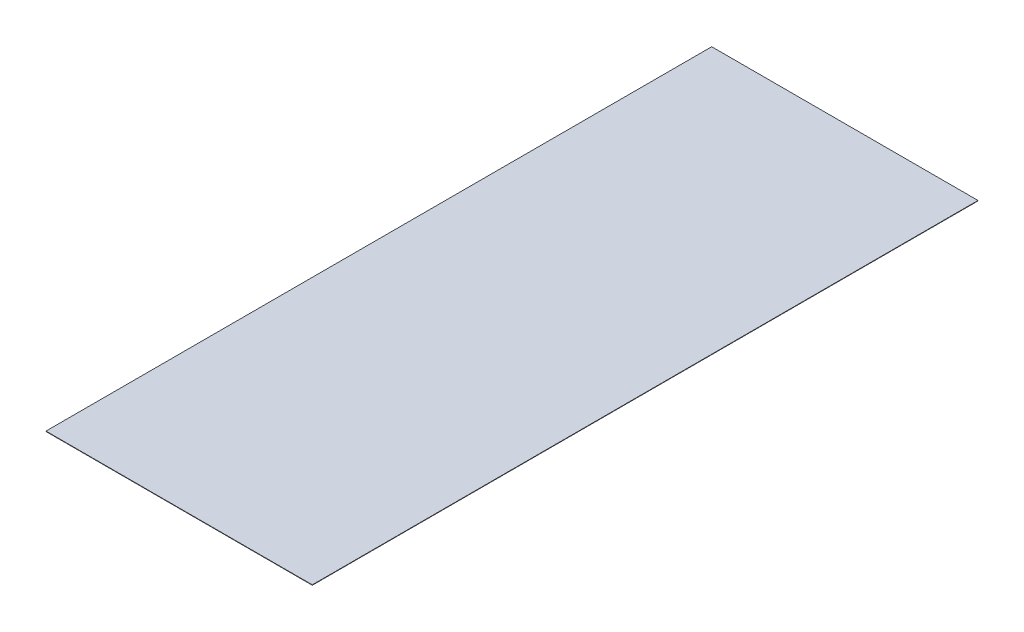
ISO-10303-21;
HEADER;
FILE_DESCRIPTION(('STEP AP214'),'2;1');
FILE_NAME('part.step','',(''),(''),'','','');
FILE_SCHEMA(('AUTOMOTIVE_DESIGN { 1 0 10303 214 1 1 1 1 }'));
ENDSEC;
DATA;
#1=APPLICATION_CONTEXT('core data for automotive mechanical design processes');
#2=APPLICATION_PROTOCOL_DEFINITION('international standard','automotive_design',2000,#1);
#3=PRODUCT_CONTEXT('',#1,'mechanical');
#4=PRODUCT('Part','Part','',(#3));
#5=PRODUCT_RELATED_PRODUCT_CATEGORY('part','',(#4));
#6=PRODUCT_DEFINITION_FORMATION('','',#4);
#7=PRODUCT_DEFINITION_CONTEXT('part definition',#1,'design');
#8=PRODUCT_DEFINITION('design','',#6,#7);
#9=PRODUCT_DEFINITION_SHAPE('','',#8);
#10=(LENGTH_UNIT() NAMED_UNIT(*) SI_UNIT(.MILLI.,.METRE.));
#11=(NAMED_UNIT(*) PLANE_ANGLE_UNIT() SI_UNIT($,.RADIAN.));
#12=(NAMED_UNIT(*) SI_UNIT($,.STERADIAN.) SOLID_ANGLE_UNIT());
#13=UNCERTAINTY_MEASURE_WITH_UNIT(LENGTH_MEASURE(1.E-05),#10,'distance_accuracy_value','');
#14=(GEOMETRIC_REPRESENTATION_CONTEXT(3) GLOBAL_UNCERTAINTY_ASSIGNED_CONTEXT((#13)) GLOBAL_UNIT_ASSIGNED_CONTEXT((#10,
#11,#12)) REPRESENTATION_CONTEXT('',''));
#15=CARTESIAN_POINT('',(0.,0.,0.));
#16=DIRECTION('',(0.,0.,1.));
#17=DIRECTION('',(1.,0.,0.));
#18=AXIS2_PLACEMENT_3D('',#15,#16,#17);
#19=CARTESIAN_POINT('',(609.6,1.9,1524.));
#20=DIRECTION('',(-1.,0.,0.));
#21=DIRECTION('',(0.,0.,1.));
#22=AXIS2_PLACEMENT_3D('',#19,#20,#21);
#23=PLANE('',#22);
#24=DIRECTION('',(0.,0.,-1.));
#25=VECTOR('',#24,1.);
#26=CARTESIAN_POINT('',(609.6,0.,1524.));
#27=LINE('',#26,#25);
#28=CARTESIAN_POINT('',(609.6,0.,1524.));
#29=VERTEX_POINT('',#28);
#30=CARTESIAN_POINT('',(609.6,0.,-1524.));
#31=VERTEX_POINT('',#30);
#32=EDGE_CURVE('E96',#29,#31,#27,.T.);
#33=ORIENTED_EDGE('',*,*,#32,.T.);
#34=DIRECTION('',(0.,-1.,0.));
#35=VECTOR('',#34,1.);
#36=CARTESIAN_POINT('',(609.6,1.9,-1524.));
#37=LINE('',#36,#35);
#38=CARTESIAN_POINT('',(609.6,1.9,-1524.));
#39=VERTEX_POINT('',#38);
#40=EDGE_CURVE('E11',#39,#31,#37,.T.);
#41=ORIENTED_EDGE('',*,*,#40,.F.);
#42=DIRECTION('',(0.,0.,-1.));
#43=VECTOR('',#42,1.);
#44=CARTESIAN_POINT('',(609.6,1.9,1524.));
#45=LINE('',#44,#43);
#46=CARTESIAN_POINT('',(609.6,1.9,1524.));
#47=VERTEX_POINT('',#46);
#48=EDGE_CURVE('E84',#47,#39,#45,.T.);
#49=ORIENTED_EDGE('',*,*,#48,.F.);
#50=DIRECTION('',(0.,-1.,0.));
#51=VECTOR('',#50,1.);
#52=CARTESIAN_POINT('',(609.6,1.9,1524.));
#53=LINE('',#52,#51);
#54=EDGE_CURVE('E92',#47,#29,#53,.T.);
#55=ORIENTED_EDGE('',*,*,#54,.T.);
#56=EDGE_LOOP('',(#33,#41,#49,#55));
#57=FACE_BOUND('',#56,.T.);
#58=ADVANCED_FACE('F33',(#57),#23,.F.);
#59=CARTESIAN_POINT('',(-609.6,1.9,-1524.));
#60=DIRECTION('',(0.,0.,1.));
#61=DIRECTION('',(1.,0.,0.));
#62=AXIS2_PLACEMENT_3D('',#59,#60,#61);
#63=PLANE('',#62);
#64=DIRECTION('',(-1.,0.,0.));
#65=VECTOR('',#64,1.);
#66=CARTESIAN_POINT('',(-609.6,0.,-1524.));
#67=LINE('',#66,#65);
#68=CARTESIAN_POINT('',(-609.6,0.,-1524.));
#69=VERTEX_POINT('',#68);
#70=EDGE_CURVE('E88',#31,#69,#67,.T.);
#71=ORIENTED_EDGE('',*,*,#70,.T.);
#72=DIRECTION('',(0.,-1.,0.));
#73=VECTOR('',#72,1.);
#74=CARTESIAN_POINT('',(-609.6,1.9,-1524.));
#75=LINE('',#74,#73);
#76=CARTESIAN_POINT('',(-609.6,1.9,-1524.));
#77=VERTEX_POINT('',#76);
#78=EDGE_CURVE('E41',#77,#69,#75,.T.);
#79=ORIENTED_EDGE('',*,*,#78,.F.);
#80=DIRECTION('',(-1.,0.,0.));
#81=VECTOR('',#80,1.);
#82=CARTESIAN_POINT('',(-609.6,1.9,-1524.));
#83=LINE('',#82,#81);
#84=EDGE_CURVE('E79',#39,#77,#83,.T.);
#85=ORIENTED_EDGE('',*,*,#84,.F.);
#86=ORIENTED_EDGE('',*,*,#40,.T.);
#87=EDGE_LOOP('',(#71,#79,#85,#86));
#88=FACE_BOUND('',#87,.T.);
#89=ADVANCED_FACE('F87',(#88),#63,.F.);
#90=CARTESIAN_POINT('',(-609.6,1.9,1524.));
#91=DIRECTION('',(1.,0.,0.));
#92=DIRECTION('',(0.,0.,-1.));
#93=AXIS2_PLACEMENT_3D('',#90,#91,#92);
#94=PLANE('',#93);
#95=DIRECTION('',(0.,0.,1.));
#96=VECTOR('',#95,1.);
#97=CARTESIAN_POINT('',(-609.6,0.,1524.));
#98=LINE('',#97,#96);
#99=CARTESIAN_POINT('',(-609.6,0.,1524.));
#100=VERTEX_POINT('',#99);
#101=EDGE_CURVE('E66',#69,#100,#98,.T.);
#102=ORIENTED_EDGE('',*,*,#101,.T.);
#103=DIRECTION('',(0.,-1.,0.));
#104=VECTOR('',#103,1.);
#105=CARTESIAN_POINT('',(-609.6,1.9,1524.));
#106=LINE('',#105,#104);
#107=CARTESIAN_POINT('',(-609.6,1.9,1524.));
#108=VERTEX_POINT('',#107);
#109=EDGE_CURVE('E89',#108,#100,#106,.T.);
#110=ORIENTED_EDGE('',*,*,#109,.F.);
#111=DIRECTION('',(0.,0.,1.));
#112=VECTOR('',#111,1.);
#113=CARTESIAN_POINT('',(-609.6,1.9,1524.));
#114=LINE('',#113,#112);
#115=EDGE_CURVE('E82',#77,#108,#114,.T.);
#116=ORIENTED_EDGE('',*,*,#115,.F.);
#117=ORIENTED_EDGE('',*,*,#78,.T.);
#118=EDGE_LOOP('',(#102,#110,#116,#117));
#119=FACE_BOUND('',#118,.T.);
#120=ADVANCED_FACE('F90',(#119),#94,.F.);
#121=CARTESIAN_POINT('',(-609.6,1.9,1524.));
#122=DIRECTION('',(0.,0.,-1.));
#123=DIRECTION('',(-1.,0.,0.));
#124=AXIS2_PLACEMENT_3D('',#121,#122,#123);
#125=PLANE('',#124);
#126=DIRECTION('',(1.,0.,0.));
#127=VECTOR('',#126,1.);
#128=CARTESIAN_POINT('',(-609.6,0.,1524.));
#129=LINE('',#128,#127);
#130=EDGE_CURVE('E72',#100,#29,#129,.T.);
#131=ORIENTED_EDGE('',*,*,#130,.T.);
#132=ORIENTED_EDGE('',*,*,#54,.F.);
#133=DIRECTION('',(1.,0.,0.));
#134=VECTOR('',#133,1.);
#135=CARTESIAN_POINT('',(-609.6,1.9,1524.));
#136=LINE('',#135,#134);
#137=EDGE_CURVE('E49',#108,#47,#136,.T.);
#138=ORIENTED_EDGE('',*,*,#137,.F.);
#139=ORIENTED_EDGE('',*,*,#109,.T.);
#140=EDGE_LOOP('',(#131,#132,#138,#139));
#141=FACE_BOUND('',#140,.T.);
#142=ADVANCED_FACE('F103',(#141),#125,.F.);
#143=CARTESIAN_POINT('',(0.,1.9,0.));
#144=DIRECTION('',(0.,-1.,0.));
#145=DIRECTION('',(0.,0.,-1.));
#146=AXIS2_PLACEMENT_3D('',#143,#144,#145);
#147=PLANE('',#146);
#148=ORIENTED_EDGE('',*,*,#48,.T.);
#149=ORIENTED_EDGE('',*,*,#84,.T.);
#150=ORIENTED_EDGE('',*,*,#115,.T.);
#151=ORIENTED_EDGE('',*,*,#137,.T.);
#152=EDGE_LOOP('',(#148,#149,#150,#151));
#153=FACE_BOUND('',#152,.T.);
#154=ADVANCED_FACE('F80',(#153),#147,.F.);
#155=CARTESIAN_POINT('',(0.,0.,0.));
#156=DIRECTION('',(0.,-1.,0.));
#157=DIRECTION('',(0.,0.,-1.));
#158=AXIS2_PLACEMENT_3D('',#155,#156,#157);
#159=PLANE('',#158);
#160=ORIENTED_EDGE('',*,*,#32,.F.);
#161=ORIENTED_EDGE('',*,*,#130,.F.);
#162=ORIENTED_EDGE('',*,*,#101,.F.);
#163=ORIENTED_EDGE('',*,*,#70,.F.);
#164=EDGE_LOOP('',(#160,#161,#162,#163));
#165=FACE_BOUND('',#164,.T.);
#166=ADVANCED_FACE('F106',(#165),#159,.T.);
#167=CLOSED_SHELL('',(#58,#89,#120,#142,#154,#166));
#168=MANIFOLD_SOLID_BREP('B2',#167);
#169=ADVANCED_BREP_SHAPE_REPRESENTATION('',(#18,#168),#14);
#170=SHAPE_DEFINITION_REPRESENTATION(#9,#169);
ENDSEC;
END-ISO-10303-21;
